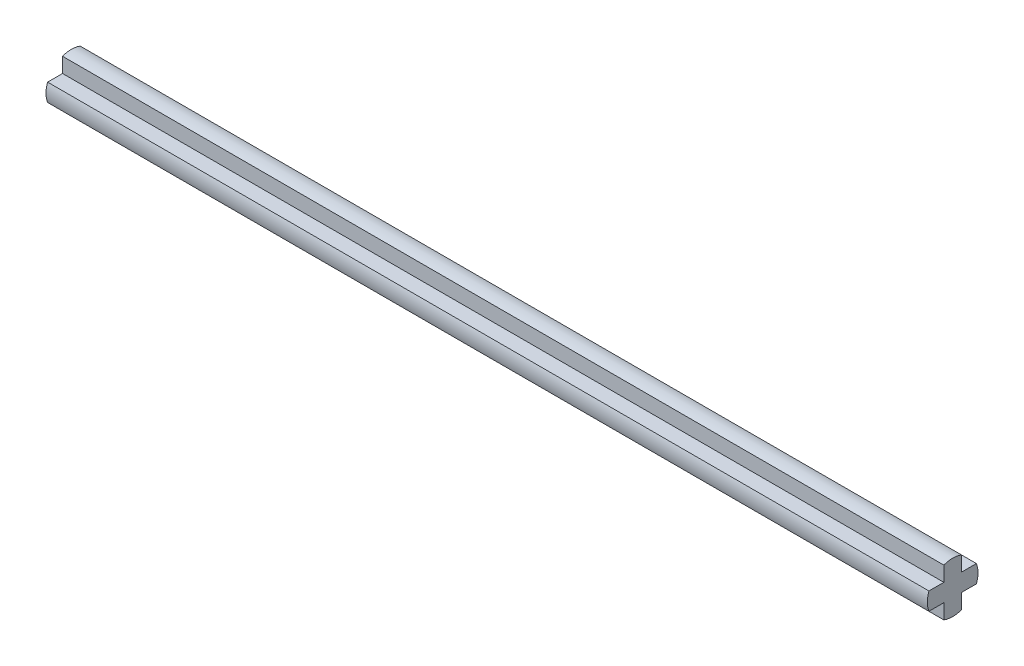
ISO-10303-21;
HEADER;
FILE_DESCRIPTION(('STEP AP214'),'2;1');
FILE_NAME('part.step','',(''),(''),'','','');
FILE_SCHEMA(('AUTOMOTIVE_DESIGN { 1 0 10303 214 1 1 1 1 }'));
ENDSEC;
DATA;
#1=APPLICATION_CONTEXT('core data for automotive mechanical design processes');
#2=APPLICATION_PROTOCOL_DEFINITION('international standard','automotive_design',2000,#1);
#3=PRODUCT_CONTEXT('',#1,'mechanical');
#4=PRODUCT('Part','Part','',(#3));
#5=PRODUCT_RELATED_PRODUCT_CATEGORY('part','',(#4));
#6=PRODUCT_DEFINITION_FORMATION('','',#4);
#7=PRODUCT_DEFINITION_CONTEXT('part definition',#1,'design');
#8=PRODUCT_DEFINITION('design','',#6,#7);
#9=PRODUCT_DEFINITION_SHAPE('','',#8);
#10=(LENGTH_UNIT() NAMED_UNIT(*) SI_UNIT(.MILLI.,.METRE.));
#11=(NAMED_UNIT(*) PLANE_ANGLE_UNIT() SI_UNIT($,.RADIAN.));
#12=(NAMED_UNIT(*) SI_UNIT($,.STERADIAN.) SOLID_ANGLE_UNIT());
#13=UNCERTAINTY_MEASURE_WITH_UNIT(LENGTH_MEASURE(1.E-05),#10,'distance_accuracy_value','');
#14=(GEOMETRIC_REPRESENTATION_CONTEXT(3) GLOBAL_UNCERTAINTY_ASSIGNED_CONTEXT((#13)) GLOBAL_UNIT_ASSIGNED_CONTEXT((#10,
#11,#12)) REPRESENTATION_CONTEXT('',''));
#15=CARTESIAN_POINT('',(0.,0.,0.));
#16=DIRECTION('',(0.,0.,1.));
#17=DIRECTION('',(1.,0.,0.));
#18=AXIS2_PLACEMENT_3D('',#15,#16,#17);
#19=CARTESIAN_POINT('',(80.,0.8,2.15638586528478));
#20=CARTESIAN_POINT('',(80.,0.,2.44361413471522));
#21=CARTESIAN_POINT('',(80.,-0.8,2.15638586528478));
#22=B_SPLINE_CURVE_WITH_KNOTS('',2,(#19,#20,#21),.UNSPECIFIED.,.F.,.F.,(3,3),(0.,1.),.UNSPECIFIED.);
#23=DIRECTION('',(-1.,0.,0.));
#24=VECTOR('',#23,1.);
#25=SURFACE_OF_LINEAR_EXTRUSION('',#22,#24);
#26=CARTESIAN_POINT('',(0.,0.8,2.15638586528478));
#27=CARTESIAN_POINT('',(0.,0.,2.44361413471522));
#28=CARTESIAN_POINT('',(0.,-0.8,2.15638586528478));
#29=B_SPLINE_CURVE_WITH_KNOTS('',2,(#26,#27,#28),.UNSPECIFIED.,.F.,.F.,(3,3),(0.,1.),.UNSPECIFIED.);
#30=CARTESIAN_POINT('',(0.,0.8,2.15638586528478));
#31=VERTEX_POINT('',#30);
#32=CARTESIAN_POINT('',(0.,-0.8,2.15638586528478));
#33=VERTEX_POINT('',#32);
#34=EDGE_CURVE('E157',#31,#33,#29,.T.);
#35=ORIENTED_EDGE('',*,*,#34,.T.);
#36=DIRECTION('',(-1.,0.,0.));
#37=VECTOR('',#36,1.);
#38=CARTESIAN_POINT('',(80.,-0.8,2.15638586528478));
#39=LINE('',#38,#37);
#40=CARTESIAN_POINT('',(80.,-0.8,2.15638586528478));
#41=VERTEX_POINT('',#40);
#42=EDGE_CURVE('E11',#41,#33,#39,.T.);
#43=ORIENTED_EDGE('',*,*,#42,.F.);
#44=CARTESIAN_POINT('',(80.,0.8,2.15638586528478));
#45=VERTEX_POINT('',#44);
#46=EDGE_CURVE('E199',#45,#41,#22,.T.);
#47=ORIENTED_EDGE('',*,*,#46,.F.);
#48=DIRECTION('',(-1.,0.,0.));
#49=VECTOR('',#48,1.);
#50=CARTESIAN_POINT('',(80.,0.8,2.15638586528478));
#51=LINE('',#50,#49);
#52=EDGE_CURVE('E150',#45,#31,#51,.T.);
#53=ORIENTED_EDGE('',*,*,#52,.T.);
#54=EDGE_LOOP('',(#35,#43,#47,#53));
#55=FACE_BOUND('',#54,.T.);
#56=ADVANCED_FACE('F33',(#55),#25,.F.);
#57=CARTESIAN_POINT('',(80.,-0.8,0.8));
#58=DIRECTION('',(0.,1.,0.));
#59=DIRECTION('',(0.,0.,1.));
#60=AXIS2_PLACEMENT_3D('',#57,#58,#59);
#61=PLANE('',#60);
#62=DIRECTION('',(0.,0.,-1.));
#63=VECTOR('',#62,1.);
#64=CARTESIAN_POINT('',(0.,-0.8,0.8));
#65=LINE('',#64,#63);
#66=CARTESIAN_POINT('',(0.,-0.8,0.8));
#67=VERTEX_POINT('',#66);
#68=EDGE_CURVE('E162',#33,#67,#65,.T.);
#69=ORIENTED_EDGE('',*,*,#68,.T.);
#70=DIRECTION('',(-1.,0.,0.));
#71=VECTOR('',#70,1.);
#72=CARTESIAN_POINT('',(80.,-0.8,0.8));
#73=LINE('',#72,#71);
#74=CARTESIAN_POINT('',(80.,-0.8,0.8));
#75=VERTEX_POINT('',#74);
#76=EDGE_CURVE('E42',#75,#67,#73,.T.);
#77=ORIENTED_EDGE('',*,*,#76,.F.);
#78=DIRECTION('',(0.,0.,-1.));
#79=VECTOR('',#78,1.);
#80=CARTESIAN_POINT('',(80.,-0.8,0.8));
#81=LINE('',#80,#79);
#82=EDGE_CURVE('E105',#41,#75,#81,.T.);
#83=ORIENTED_EDGE('',*,*,#82,.F.);
#84=ORIENTED_EDGE('',*,*,#42,.T.);
#85=EDGE_LOOP('',(#69,#77,#83,#84));
#86=FACE_BOUND('',#85,.T.);
#87=ADVANCED_FACE('F279',(#86),#61,.F.);
#88=CARTESIAN_POINT('',(80.,-2.15638586528478,0.8));
#89=DIRECTION('',(0.,0.,-1.));
#90=DIRECTION('',(-1.,0.,0.));
#91=AXIS2_PLACEMENT_3D('',#88,#89,#90);
#92=PLANE('',#91);
#93=DIRECTION('',(0.,-1.,0.));
#94=VECTOR('',#93,1.);
#95=CARTESIAN_POINT('',(0.,-2.15638586528478,0.8));
#96=LINE('',#95,#94);
#97=CARTESIAN_POINT('',(0.,-2.15638586528478,0.8));
#98=VERTEX_POINT('',#97);
#99=EDGE_CURVE('E167',#67,#98,#96,.T.);
#100=ORIENTED_EDGE('',*,*,#99,.T.);
#101=DIRECTION('',(-1.,0.,0.));
#102=VECTOR('',#101,1.);
#103=CARTESIAN_POINT('',(80.,-2.15638586528478,0.8));
#104=LINE('',#103,#102);
#105=CARTESIAN_POINT('',(80.,-2.15638586528478,0.8));
#106=VERTEX_POINT('',#105);
#107=EDGE_CURVE('E218',#106,#98,#104,.T.);
#108=ORIENTED_EDGE('',*,*,#107,.F.);
#109=DIRECTION('',(0.,-1.,0.));
#110=VECTOR('',#109,1.);
#111=CARTESIAN_POINT('',(80.,-2.15638586528478,0.8));
#112=LINE('',#111,#110);
#113=EDGE_CURVE('E226',#75,#106,#112,.T.);
#114=ORIENTED_EDGE('',*,*,#113,.F.);
#115=ORIENTED_EDGE('',*,*,#76,.T.);
#116=EDGE_LOOP('',(#100,#108,#114,#115));
#117=FACE_BOUND('',#116,.T.);
#118=ADVANCED_FACE('F224',(#117),#92,.F.);
#119=CARTESIAN_POINT('',(80.,-2.15638586528478,0.8));
#120=CARTESIAN_POINT('',(80.,-2.44361413471522,0.));
#121=CARTESIAN_POINT('',(80.,-2.15638586528478,-0.8));
#122=B_SPLINE_CURVE_WITH_KNOTS('',2,(#119,#120,#121),.UNSPECIFIED.,.F.,.F.,(3,3),(0.,1.),.UNSPECIFIED.);
#123=DIRECTION('',(-1.,0.,0.));
#124=VECTOR('',#123,1.);
#125=SURFACE_OF_LINEAR_EXTRUSION('',#122,#124);
#126=CARTESIAN_POINT('',(0.,-2.15638586528478,0.8));
#127=CARTESIAN_POINT('',(0.,-2.44361413471522,0.));
#128=CARTESIAN_POINT('',(0.,-2.15638586528478,-0.8));
#129=B_SPLINE_CURVE_WITH_KNOTS('',2,(#126,#127,#128),.UNSPECIFIED.,.F.,.F.,(3,3),(0.,1.),.UNSPECIFIED.);
#130=CARTESIAN_POINT('',(0.,-2.15638586528478,-0.8));
#131=VERTEX_POINT('',#130);
#132=EDGE_CURVE('E169',#98,#131,#129,.T.);
#133=ORIENTED_EDGE('',*,*,#132,.T.);
#134=DIRECTION('',(-1.,0.,0.));
#135=VECTOR('',#134,1.);
#136=CARTESIAN_POINT('',(80.,-2.15638586528478,-0.8));
#137=LINE('',#136,#135);
#138=CARTESIAN_POINT('',(80.,-2.15638586528478,-0.8));
#139=VERTEX_POINT('',#138);
#140=EDGE_CURVE('E215',#139,#131,#137,.T.);
#141=ORIENTED_EDGE('',*,*,#140,.F.);
#142=EDGE_CURVE('E244',#106,#139,#122,.T.);
#143=ORIENTED_EDGE('',*,*,#142,.F.);
#144=ORIENTED_EDGE('',*,*,#107,.T.);
#145=EDGE_LOOP('',(#133,#141,#143,#144));
#146=FACE_BOUND('',#145,.T.);
#147=ADVANCED_FACE('F235',(#146),#125,.F.);
#148=CARTESIAN_POINT('',(80.,-0.8,-0.8));
#149=DIRECTION('',(0.,0.,1.));
#150=DIRECTION('',(0.,-1.,0.));
#151=AXIS2_PLACEMENT_3D('',#148,#149,#150);
#152=PLANE('',#151);
#153=DIRECTION('',(0.,1.,0.));
#154=VECTOR('',#153,1.);
#155=CARTESIAN_POINT('',(0.,-0.8,-0.8));
#156=LINE('',#155,#154);
#157=CARTESIAN_POINT('',(0.,-0.8,-0.8));
#158=VERTEX_POINT('',#157);
#159=EDGE_CURVE('E173',#131,#158,#156,.T.);
#160=ORIENTED_EDGE('',*,*,#159,.T.);
#161=DIRECTION('',(-1.,0.,0.));
#162=VECTOR('',#161,1.);
#163=CARTESIAN_POINT('',(80.,-0.8,-0.8));
#164=LINE('',#163,#162);
#165=CARTESIAN_POINT('',(80.,-0.8,-0.8));
#166=VERTEX_POINT('',#165);
#167=EDGE_CURVE('E212',#166,#158,#164,.T.);
#168=ORIENTED_EDGE('',*,*,#167,.F.);
#169=DIRECTION('',(0.,1.,0.));
#170=VECTOR('',#169,1.);
#171=CARTESIAN_POINT('',(80.,-0.8,-0.8));
#172=LINE('',#171,#170);
#173=EDGE_CURVE('E241',#139,#166,#172,.T.);
#174=ORIENTED_EDGE('',*,*,#173,.F.);
#175=ORIENTED_EDGE('',*,*,#140,.T.);
#176=EDGE_LOOP('',(#160,#168,#174,#175));
#177=FACE_BOUND('',#176,.T.);
#178=ADVANCED_FACE('F239',(#177),#152,.F.);
#179=CARTESIAN_POINT('',(80.,-0.8,-2.15638586528478));
#180=DIRECTION('',(0.,1.,0.));
#181=DIRECTION('',(0.,0.,1.));
#182=AXIS2_PLACEMENT_3D('',#179,#180,#181);
#183=PLANE('',#182);
#184=DIRECTION('',(0.,0.,-1.));
#185=VECTOR('',#184,1.);
#186=CARTESIAN_POINT('',(0.,-0.8,-2.15638586528478));
#187=LINE('',#186,#185);
#188=CARTESIAN_POINT('',(0.,-0.8,-2.15638586528478));
#189=VERTEX_POINT('',#188);
#190=EDGE_CURVE('E178',#158,#189,#187,.T.);
#191=ORIENTED_EDGE('',*,*,#190,.T.);
#192=DIRECTION('',(-1.,0.,0.));
#193=VECTOR('',#192,1.);
#194=CARTESIAN_POINT('',(80.,-0.8,-2.15638586528478));
#195=LINE('',#194,#193);
#196=CARTESIAN_POINT('',(80.,-0.8,-2.15638586528478));
#197=VERTEX_POINT('',#196);
#198=EDGE_CURVE('E209',#197,#189,#195,.T.);
#199=ORIENTED_EDGE('',*,*,#198,.F.);
#200=DIRECTION('',(0.,0.,-1.));
#201=VECTOR('',#200,1.);
#202=CARTESIAN_POINT('',(80.,-0.8,-2.15638586528478));
#203=LINE('',#202,#201);
#204=EDGE_CURVE('E243',#166,#197,#203,.T.);
#205=ORIENTED_EDGE('',*,*,#204,.F.);
#206=ORIENTED_EDGE('',*,*,#167,.T.);
#207=EDGE_LOOP('',(#191,#199,#205,#206));
#208=FACE_BOUND('',#207,.T.);
#209=ADVANCED_FACE('F268',(#208),#183,.F.);
#210=CARTESIAN_POINT('',(80.,-0.8,-2.15638586528478));
#211=CARTESIAN_POINT('',(80.,0.,-2.44361413471522));
#212=CARTESIAN_POINT('',(80.,0.8,-2.15638586528478));
#213=B_SPLINE_CURVE_WITH_KNOTS('',2,(#210,#211,#212),.UNSPECIFIED.,.F.,.F.,(3,3),(0.,1.),.UNSPECIFIED.);
#214=DIRECTION('',(-1.,0.,0.));
#215=VECTOR('',#214,1.);
#216=SURFACE_OF_LINEAR_EXTRUSION('',#213,#215);
#217=CARTESIAN_POINT('',(0.,-0.8,-2.15638586528478));
#218=CARTESIAN_POINT('',(0.,0.,-2.44361413471522));
#219=CARTESIAN_POINT('',(0.,0.8,-2.15638586528478));
#220=B_SPLINE_CURVE_WITH_KNOTS('',2,(#217,#218,#219),.UNSPECIFIED.,.F.,.F.,(3,3),(0.,1.),.UNSPECIFIED.);
#221=CARTESIAN_POINT('',(0.,0.8,-2.15638586528478));
#222=VERTEX_POINT('',#221);
#223=EDGE_CURVE('E180',#189,#222,#220,.T.);
#224=ORIENTED_EDGE('',*,*,#223,.T.);
#225=DIRECTION('',(-1.,0.,0.));
#226=VECTOR('',#225,1.);
#227=CARTESIAN_POINT('',(80.,0.8,-2.15638586528478));
#228=LINE('',#227,#226);
#229=CARTESIAN_POINT('',(80.,0.8,-2.15638586528478));
#230=VERTEX_POINT('',#229);
#231=EDGE_CURVE('E206',#230,#222,#228,.T.);
#232=ORIENTED_EDGE('',*,*,#231,.F.);
#233=EDGE_CURVE('E246',#197,#230,#213,.T.);
#234=ORIENTED_EDGE('',*,*,#233,.F.);
#235=ORIENTED_EDGE('',*,*,#198,.T.);
#236=EDGE_LOOP('',(#224,#232,#234,#235));
#237=FACE_BOUND('',#236,.T.);
#238=ADVANCED_FACE('F263',(#237),#216,.F.);
#239=CARTESIAN_POINT('',(80.,0.8,-0.8));
#240=DIRECTION('',(0.,-1.,0.));
#241=DIRECTION('',(0.,0.,-1.));
#242=AXIS2_PLACEMENT_3D('',#239,#240,#241);
#243=PLANE('',#242);
#244=DIRECTION('',(0.,0.,1.));
#245=VECTOR('',#244,1.);
#246=CARTESIAN_POINT('',(0.,0.8,-0.8));
#247=LINE('',#246,#245);
#248=CARTESIAN_POINT('',(0.,0.8,-0.8));
#249=VERTEX_POINT('',#248);
#250=EDGE_CURVE('E184',#222,#249,#247,.T.);
#251=ORIENTED_EDGE('',*,*,#250,.T.);
#252=DIRECTION('',(-1.,0.,0.));
#253=VECTOR('',#252,1.);
#254=CARTESIAN_POINT('',(80.,0.8,-0.8));
#255=LINE('',#254,#253);
#256=CARTESIAN_POINT('',(80.,0.8,-0.8));
#257=VERTEX_POINT('',#256);
#258=EDGE_CURVE('E203',#257,#249,#255,.T.);
#259=ORIENTED_EDGE('',*,*,#258,.F.);
#260=DIRECTION('',(0.,0.,1.));
#261=VECTOR('',#260,1.);
#262=CARTESIAN_POINT('',(80.,0.8,-0.8));
#263=LINE('',#262,#261);
#264=EDGE_CURVE('E258',#230,#257,#263,.T.);
#265=ORIENTED_EDGE('',*,*,#264,.F.);
#266=ORIENTED_EDGE('',*,*,#231,.T.);
#267=EDGE_LOOP('',(#251,#259,#265,#266));
#268=FACE_BOUND('',#267,.T.);
#269=ADVANCED_FACE('F267',(#268),#243,.F.);
#270=CARTESIAN_POINT('',(80.,2.15638586528478,-0.8));
#271=DIRECTION('',(0.,0.,1.));
#272=DIRECTION('',(1.,0.,0.));
#273=AXIS2_PLACEMENT_3D('',#270,#271,#272);
#274=PLANE('',#273);
#275=DIRECTION('',(0.,1.,0.));
#276=VECTOR('',#275,1.);
#277=CARTESIAN_POINT('',(0.,2.15638586528478,-0.8));
#278=LINE('',#277,#276);
#279=CARTESIAN_POINT('',(0.,2.15638586528478,-0.8));
#280=VERTEX_POINT('',#279);
#281=EDGE_CURVE('E189',#249,#280,#278,.T.);
#282=ORIENTED_EDGE('',*,*,#281,.T.);
#283=DIRECTION('',(-1.,0.,0.));
#284=VECTOR('',#283,1.);
#285=CARTESIAN_POINT('',(80.,2.15638586528478,-0.8));
#286=LINE('',#285,#284);
#287=CARTESIAN_POINT('',(80.,2.15638586528478,-0.8));
#288=VERTEX_POINT('',#287);
#289=EDGE_CURVE('E145',#288,#280,#286,.T.);
#290=ORIENTED_EDGE('',*,*,#289,.F.);
#291=DIRECTION('',(0.,1.,0.));
#292=VECTOR('',#291,1.);
#293=CARTESIAN_POINT('',(80.,2.15638586528478,-0.8));
#294=LINE('',#293,#292);
#295=EDGE_CURVE('E136',#257,#288,#294,.T.);
#296=ORIENTED_EDGE('',*,*,#295,.F.);
#297=ORIENTED_EDGE('',*,*,#258,.T.);
#298=EDGE_LOOP('',(#282,#290,#296,#297));
#299=FACE_BOUND('',#298,.T.);
#300=ADVANCED_FACE('F291',(#299),#274,.F.);
#301=CARTESIAN_POINT('',(80.,2.15638586528478,-0.8));
#302=CARTESIAN_POINT('',(80.,2.44361413471522,0.));
#303=CARTESIAN_POINT('',(80.,2.15638586528478,0.8));
#304=B_SPLINE_CURVE_WITH_KNOTS('',2,(#301,#302,#303),.UNSPECIFIED.,.F.,.F.,(3,3),(0.,1.),.UNSPECIFIED.);
#305=DIRECTION('',(-1.,0.,0.));
#306=VECTOR('',#305,1.);
#307=SURFACE_OF_LINEAR_EXTRUSION('',#304,#306);
#308=CARTESIAN_POINT('',(0.,2.15638586528478,-0.8));
#309=CARTESIAN_POINT('',(0.,2.44361413471522,0.));
#310=CARTESIAN_POINT('',(0.,2.15638586528478,0.8));
#311=B_SPLINE_CURVE_WITH_KNOTS('',2,(#308,#309,#310),.UNSPECIFIED.,.F.,.F.,(3,3),(0.,1.),.UNSPECIFIED.);
#312=CARTESIAN_POINT('',(0.,2.15638586528478,0.8));
#313=VERTEX_POINT('',#312);
#314=EDGE_CURVE('E144',#280,#313,#311,.T.);
#315=ORIENTED_EDGE('',*,*,#314,.T.);
#316=DIRECTION('',(-1.,0.,0.));
#317=VECTOR('',#316,1.);
#318=CARTESIAN_POINT('',(80.,2.15638586528478,0.8));
#319=LINE('',#318,#317);
#320=CARTESIAN_POINT('',(80.,2.15638586528478,0.8));
#321=VERTEX_POINT('',#320);
#322=EDGE_CURVE('E141',#321,#313,#319,.T.);
#323=ORIENTED_EDGE('',*,*,#322,.F.);
#324=EDGE_CURVE('E130',#288,#321,#304,.T.);
#325=ORIENTED_EDGE('',*,*,#324,.F.);
#326=ORIENTED_EDGE('',*,*,#289,.T.);
#327=EDGE_LOOP('',(#315,#323,#325,#326));
#328=FACE_BOUND('',#327,.T.);
#329=ADVANCED_FACE('F142',(#328),#307,.F.);
#330=CARTESIAN_POINT('',(80.,0.8,0.8));
#331=DIRECTION('',(0.,0.,-1.));
#332=DIRECTION('',(-1.,0.,0.));
#333=AXIS2_PLACEMENT_3D('',#330,#331,#332);
#334=PLANE('',#333);
#335=DIRECTION('',(0.,-1.,0.));
#336=VECTOR('',#335,1.);
#337=CARTESIAN_POINT('',(0.,0.8,0.8));
#338=LINE('',#337,#336);
#339=CARTESIAN_POINT('',(0.,0.8,0.8));
#340=VERTEX_POINT('',#339);
#341=EDGE_CURVE('E91',#313,#340,#338,.T.);
#342=ORIENTED_EDGE('',*,*,#341,.T.);
#343=DIRECTION('',(-1.,0.,0.));
#344=VECTOR('',#343,1.);
#345=CARTESIAN_POINT('',(80.,0.8,0.8));
#346=LINE('',#345,#344);
#347=CARTESIAN_POINT('',(80.,0.8,0.8));
#348=VERTEX_POINT('',#347);
#349=EDGE_CURVE('E146',#348,#340,#346,.T.);
#350=ORIENTED_EDGE('',*,*,#349,.F.);
#351=DIRECTION('',(0.,-1.,0.));
#352=VECTOR('',#351,1.);
#353=CARTESIAN_POINT('',(80.,0.8,0.8));
#354=LINE('',#353,#352);
#355=EDGE_CURVE('E134',#321,#348,#354,.T.);
#356=ORIENTED_EDGE('',*,*,#355,.F.);
#357=ORIENTED_EDGE('',*,*,#322,.T.);
#358=EDGE_LOOP('',(#342,#350,#356,#357));
#359=FACE_BOUND('',#358,.T.);
#360=ADVANCED_FACE('F148',(#359),#334,.F.);
#361=CARTESIAN_POINT('',(80.,0.8,2.15638586528478));
#362=DIRECTION('',(0.,-1.,0.));
#363=DIRECTION('',(0.,0.,-1.));
#364=AXIS2_PLACEMENT_3D('',#361,#362,#363);
#365=PLANE('',#364);
#366=DIRECTION('',(0.,0.,1.));
#367=VECTOR('',#366,1.);
#368=CARTESIAN_POINT('',(0.,0.8,2.15638586528478));
#369=LINE('',#368,#367);
#370=EDGE_CURVE('E97',#340,#31,#369,.T.);
#371=ORIENTED_EDGE('',*,*,#370,.T.);
#372=ORIENTED_EDGE('',*,*,#52,.F.);
#373=DIRECTION('',(0.,0.,1.));
#374=VECTOR('',#373,1.);
#375=CARTESIAN_POINT('',(80.,0.8,2.15638586528478));
#376=LINE('',#375,#374);
#377=EDGE_CURVE('E50',#348,#45,#376,.T.);
#378=ORIENTED_EDGE('',*,*,#377,.F.);
#379=ORIENTED_EDGE('',*,*,#349,.T.);
#380=EDGE_LOOP('',(#371,#372,#378,#379));
#381=FACE_BOUND('',#380,.T.);
#382=ADVANCED_FACE('F309',(#381),#365,.F.);
#383=CARTESIAN_POINT('',(80.,0.,2.3));
#384=DIRECTION('',(1.,0.,0.));
#385=DIRECTION('',(0.,0.,-1.));
#386=AXIS2_PLACEMENT_3D('',#383,#384,#385);
#387=PLANE('',#386);
#388=ORIENTED_EDGE('',*,*,#46,.T.);
#389=ORIENTED_EDGE('',*,*,#82,.T.);
#390=ORIENTED_EDGE('',*,*,#113,.T.);
#391=ORIENTED_EDGE('',*,*,#142,.T.);
#392=ORIENTED_EDGE('',*,*,#173,.T.);
#393=ORIENTED_EDGE('',*,*,#204,.T.);
#394=ORIENTED_EDGE('',*,*,#233,.T.);
#395=ORIENTED_EDGE('',*,*,#264,.T.);
#396=ORIENTED_EDGE('',*,*,#295,.T.);
#397=ORIENTED_EDGE('',*,*,#324,.T.);
#398=ORIENTED_EDGE('',*,*,#355,.T.);
#399=ORIENTED_EDGE('',*,*,#377,.T.);
#400=EDGE_LOOP('',(#388,#389,#390,#391,#392,#393,#394,#395,#396,#397,#398,#399));
#401=FACE_BOUND('',#400,.T.);
#402=ADVANCED_FACE('F132',(#401),#387,.T.);
#403=CARTESIAN_POINT('',(0.,0.,2.3));
#404=DIRECTION('',(1.,0.,0.));
#405=DIRECTION('',(0.,0.,-1.));
#406=AXIS2_PLACEMENT_3D('',#403,#404,#405);
#407=PLANE('',#406);
#408=ORIENTED_EDGE('',*,*,#34,.F.);
#409=ORIENTED_EDGE('',*,*,#370,.F.);
#410=ORIENTED_EDGE('',*,*,#341,.F.);
#411=ORIENTED_EDGE('',*,*,#314,.F.);
#412=ORIENTED_EDGE('',*,*,#281,.F.);
#413=ORIENTED_EDGE('',*,*,#250,.F.);
#414=ORIENTED_EDGE('',*,*,#223,.F.);
#415=ORIENTED_EDGE('',*,*,#190,.F.);
#416=ORIENTED_EDGE('',*,*,#159,.F.);
#417=ORIENTED_EDGE('',*,*,#132,.F.);
#418=ORIENTED_EDGE('',*,*,#99,.F.);
#419=ORIENTED_EDGE('',*,*,#68,.F.);
#420=EDGE_LOOP('',(#408,#409,#410,#411,#412,#413,#414,#415,#416,#417,#418,#419));
#421=FACE_BOUND('',#420,.T.);
#422=ADVANCED_FACE('F230',(#421),#407,.F.);
#423=CLOSED_SHELL('',(#56,#87,#118,#147,#178,#209,#238,#269,#300,#329,#360,#382,#402,#422));
#424=MANIFOLD_SOLID_BREP('B2',#423);
#425=ADVANCED_BREP_SHAPE_REPRESENTATION('',(#18,#424),#14);
#426=SHAPE_DEFINITION_REPRESENTATION(#9,#425);
ENDSEC;
END-ISO-10303-21;
